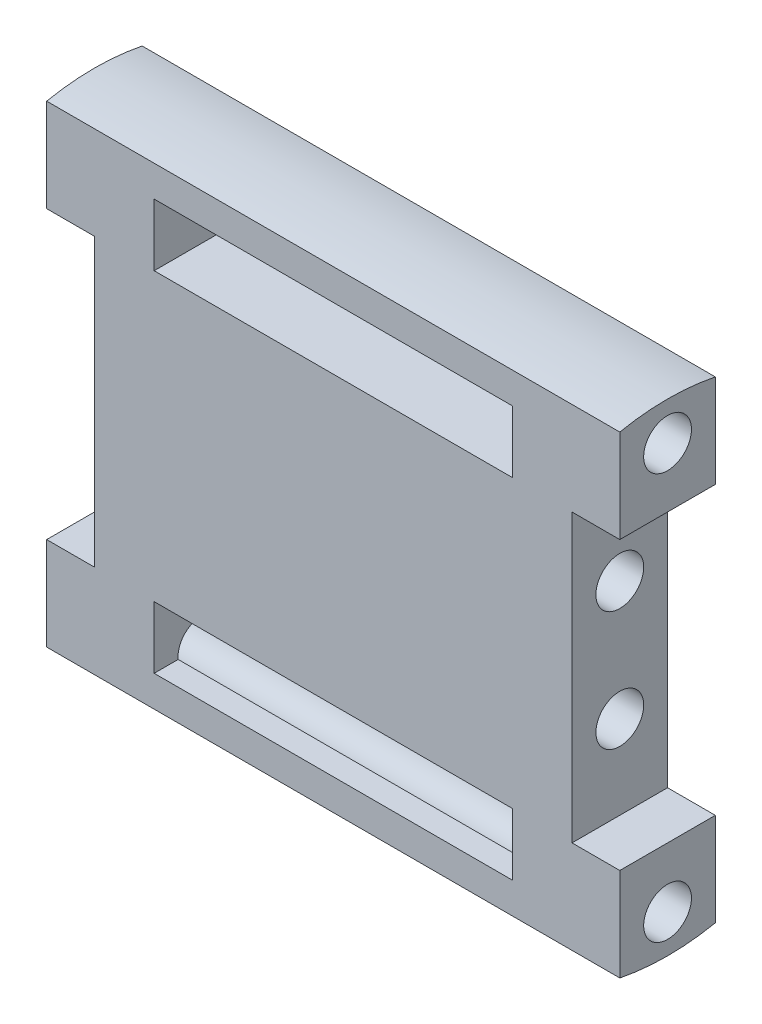
ISO-10303-21;
HEADER;
FILE_DESCRIPTION(('STEP AP214'),'2;1');
FILE_NAME('part.step','',(''),(''),'','','');
FILE_SCHEMA(('AUTOMOTIVE_DESIGN { 1 0 10303 214 1 1 1 1 }'));
ENDSEC;
DATA;
#1=APPLICATION_CONTEXT('core data for automotive mechanical design processes');
#2=APPLICATION_PROTOCOL_DEFINITION('international standard','automotive_design',2000,#1);
#3=PRODUCT_CONTEXT('',#1,'mechanical');
#4=PRODUCT('Part','Part','',(#3));
#5=PRODUCT_RELATED_PRODUCT_CATEGORY('part','',(#4));
#6=PRODUCT_DEFINITION_FORMATION('','',#4);
#7=PRODUCT_DEFINITION_CONTEXT('part definition',#1,'design');
#8=PRODUCT_DEFINITION('design','',#6,#7);
#9=PRODUCT_DEFINITION_SHAPE('','',#8);
#10=(LENGTH_UNIT() NAMED_UNIT(*) SI_UNIT(.MILLI.,.METRE.));
#11=(NAMED_UNIT(*) PLANE_ANGLE_UNIT() SI_UNIT($,.RADIAN.));
#12=(NAMED_UNIT(*) SI_UNIT($,.STERADIAN.) SOLID_ANGLE_UNIT());
#13=UNCERTAINTY_MEASURE_WITH_UNIT(LENGTH_MEASURE(1.E-05),#10,'distance_accuracy_value','');
#14=(GEOMETRIC_REPRESENTATION_CONTEXT(3) GLOBAL_UNCERTAINTY_ASSIGNED_CONTEXT((#13)) GLOBAL_UNIT_ASSIGNED_CONTEXT((#10,
#11,#12)) REPRESENTATION_CONTEXT('',''));
#15=CARTESIAN_POINT('',(0.,0.,0.));
#16=DIRECTION('',(0.,0.,1.));
#17=DIRECTION('',(1.,0.,0.));
#18=AXIS2_PLACEMENT_3D('',#15,#16,#17);
#19=CARTESIAN_POINT('',(125.,0.,0.));
#20=DIRECTION('',(-1.,0.,0.));
#21=DIRECTION('',(0.,0.,1.));
#22=AXIS2_PLACEMENT_3D('',#19,#20,#21);
#23=CYLINDRICAL_SURFACE('',#22,50.5);
#24=DIRECTION('',(-1.,0.,0.));
#25=VECTOR('',#24,1.);
#26=CARTESIAN_POINT('',(125.,49.5,-10.));
#27=LINE('',#26,#25);
#28=CARTESIAN_POINT('',(125.,49.5,-10.));
#29=VERTEX_POINT('',#28);
#30=CARTESIAN_POINT('',(5.,49.5,-10.));
#31=VERTEX_POINT('',#30);
#32=EDGE_CURVE('E362',#29,#31,#27,.T.);
#33=ORIENTED_EDGE('',*,*,#32,.T.);
#34=CARTESIAN_POINT('',(5.,0.,0.));
#35=DIRECTION('',(1.,0.,0.));
#36=DIRECTION('',(0.,0.,-1.));
#37=AXIS2_PLACEMENT_3D('',#34,#35,#36);
#38=CIRCLE('',#37,50.5);
#39=CARTESIAN_POINT('',(5.,49.5,10.));
#40=VERTEX_POINT('',#39);
#41=EDGE_CURVE('E379',#31,#40,#38,.T.);
#42=ORIENTED_EDGE('',*,*,#41,.T.);
#43=DIRECTION('',(-1.,0.,0.));
#44=VECTOR('',#43,1.);
#45=CARTESIAN_POINT('',(125.,49.5,10.));
#46=LINE('',#45,#44);
#47=CARTESIAN_POINT('',(125.,49.5,10.));
#48=VERTEX_POINT('',#47);
#49=EDGE_CURVE('E233',#48,#40,#46,.T.);
#50=ORIENTED_EDGE('',*,*,#49,.F.);
#51=CARTESIAN_POINT('',(125.,0.,0.));
#52=DIRECTION('',(1.,0.,0.));
#53=DIRECTION('',(0.,0.,-1.));
#54=AXIS2_PLACEMENT_3D('',#51,#52,#53);
#55=CIRCLE('',#54,50.5);
#56=EDGE_CURVE('E377',#29,#48,#55,.T.);
#57=ORIENTED_EDGE('',*,*,#56,.F.);
#58=EDGE_LOOP('',(#33,#42,#50,#57));
#59=FACE_BOUND('',#58,.T.);
#60=ADVANCED_FACE('F36',(#59),#23,.T.);
#61=DIRECTION('',(-1.,0.,0.));
#62=VECTOR('',#61,1.);
#63=CARTESIAN_POINT('',(125.,-49.5,10.));
#64=LINE('',#63,#62);
#65=CARTESIAN_POINT('',(125.,-49.5,9.99999999999999));
#66=VERTEX_POINT('',#65);
#67=CARTESIAN_POINT('',(5.,-49.5,10.));
#68=VERTEX_POINT('',#67);
#69=EDGE_CURVE('E365',#66,#68,#64,.T.);
#70=ORIENTED_EDGE('',*,*,#69,.T.);
#71=CARTESIAN_POINT('',(5.,-49.5,-10.));
#72=VERTEX_POINT('',#71);
#73=EDGE_CURVE('E382',#68,#72,#38,.T.);
#74=ORIENTED_EDGE('',*,*,#73,.T.);
#75=DIRECTION('',(-1.,0.,0.));
#76=VECTOR('',#75,1.);
#77=CARTESIAN_POINT('',(125.,-49.5,-10.));
#78=LINE('',#77,#76);
#79=CARTESIAN_POINT('',(125.,-49.5,-10.));
#80=VERTEX_POINT('',#79);
#81=EDGE_CURVE('E226',#80,#72,#78,.T.);
#82=ORIENTED_EDGE('',*,*,#81,.F.);
#83=EDGE_CURVE('E393',#66,#80,#55,.T.);
#84=ORIENTED_EDGE('',*,*,#83,.F.);
#85=EDGE_LOOP('',(#70,#74,#82,#84));
#86=FACE_BOUND('',#85,.T.);
#87=ADVANCED_FACE('F444',(#86),#23,.T.);
#88=CARTESIAN_POINT('',(390.,42.5,0.));
#89=DIRECTION('',(-1.,0.,0.));
#90=DIRECTION('',(0.,0.,1.));
#91=AXIS2_PLACEMENT_3D('',#88,#89,#90);
#92=CYLINDRICAL_SURFACE('',#91,5.);
#93=CARTESIAN_POINT('',(5.,42.5,0.));
#94=DIRECTION('',(1.,0.,0.));
#95=DIRECTION('',(0.,0.,-1.));
#96=AXIS2_PLACEMENT_3D('',#93,#94,#95);
#97=CIRCLE('',#96,5.);
#98=CARTESIAN_POINT('',(5.,42.5,-5.));
#99=VERTEX_POINT('',#98);
#100=EDGE_CURVE('E385',#99,#99,#97,.T.);
#101=ORIENTED_EDGE('',*,*,#100,.F.);
#102=EDGE_LOOP('',(#101));
#103=FACE_BOUND('',#102,.T.);
#104=CARTESIAN_POINT('',(27.5,42.5,0.));
#105=DIRECTION('',(-1.,0.,0.));
#106=DIRECTION('',(0.,0.,1.));
#107=AXIS2_PLACEMENT_3D('',#104,#105,#106);
#108=CIRCLE('',#107,5.);
#109=CARTESIAN_POINT('',(27.5,43.,-4.9749371855331));
#110=VERTEX_POINT('',#109);
#111=CARTESIAN_POINT('',(27.5,43.,4.9749371855331));
#112=VERTEX_POINT('',#111);
#113=EDGE_CURVE('E254',#110,#112,#108,.T.);
#114=ORIENTED_EDGE('',*,*,#113,.F.);
#115=DIRECTION('',(-1.,0.,0.));
#116=VECTOR('',#115,1.);
#117=CARTESIAN_POINT('',(390.,43.,-4.9749371855331));
#118=LINE('',#117,#116);
#119=CARTESIAN_POINT('',(102.5,43.,-4.9749371855331));
#120=VERTEX_POINT('',#119);
#121=EDGE_CURVE('E252',#120,#110,#118,.T.);
#122=ORIENTED_EDGE('',*,*,#121,.F.);
#123=CARTESIAN_POINT('',(102.5,42.5,0.));
#124=DIRECTION('',(1.,0.,0.));
#125=DIRECTION('',(0.,1.,0.));
#126=AXIS2_PLACEMENT_3D('',#123,#124,#125);
#127=CIRCLE('',#126,5.);
#128=CARTESIAN_POINT('',(102.5,43.,4.9749371855331));
#129=VERTEX_POINT('',#128);
#130=EDGE_CURVE('E247',#129,#120,#127,.T.);
#131=ORIENTED_EDGE('',*,*,#130,.F.);
#132=DIRECTION('',(-1.,0.,0.));
#133=VECTOR('',#132,1.);
#134=CARTESIAN_POINT('',(390.,43.,4.9749371855331));
#135=LINE('',#134,#133);
#136=EDGE_CURVE('E249',#112,#129,#135,.F.);
#137=ORIENTED_EDGE('',*,*,#136,.F.);
#138=EDGE_LOOP('',(#114,#122,#131,#137));
#139=FACE_BOUND('',#138,.T.);
#140=CARTESIAN_POINT('',(125.,42.5,0.));
#141=DIRECTION('',(1.,0.,0.));
#142=DIRECTION('',(0.,0.,-1.));
#143=AXIS2_PLACEMENT_3D('',#140,#141,#142);
#144=CIRCLE('',#143,5.);
#145=CARTESIAN_POINT('',(125.,42.5,-5.));
#146=VERTEX_POINT('',#145);
#147=EDGE_CURVE('E390',#146,#146,#144,.T.);
#148=ORIENTED_EDGE('',*,*,#147,.T.);
#149=EDGE_LOOP('',(#148));
#150=FACE_BOUND('',#149,.T.);
#151=ADVANCED_FACE('F448',(#103,#139,#150),#92,.F.);
#152=CARTESIAN_POINT('',(390.,-42.5,0.));
#153=DIRECTION('',(-1.,0.,0.));
#154=DIRECTION('',(0.,0.,1.));
#155=AXIS2_PLACEMENT_3D('',#152,#153,#154);
#156=CYLINDRICAL_SURFACE('',#155,5.);
#157=CARTESIAN_POINT('',(5.,-42.5,0.));
#158=DIRECTION('',(1.,0.,0.));
#159=DIRECTION('',(0.,0.,-1.));
#160=AXIS2_PLACEMENT_3D('',#157,#158,#159);
#161=CIRCLE('',#160,5.);
#162=CARTESIAN_POINT('',(5.,-42.5,-5.));
#163=VERTEX_POINT('',#162);
#164=EDGE_CURVE('E381',#163,#163,#161,.T.);
#165=ORIENTED_EDGE('',*,*,#164,.F.);
#166=EDGE_LOOP('',(#165));
#167=FACE_BOUND('',#166,.T.);
#168=DIRECTION('',(-1.,0.,0.));
#169=VECTOR('',#168,1.);
#170=CARTESIAN_POINT('',(390.,-43.,4.9749371855331));
#171=LINE('',#170,#169);
#172=CARTESIAN_POINT('',(102.5,-43.,4.9749371855331));
#173=VERTEX_POINT('',#172);
#174=CARTESIAN_POINT('',(27.5,-43.,4.9749371855331));
#175=VERTEX_POINT('',#174);
#176=EDGE_CURVE('E245',#173,#175,#171,.T.);
#177=ORIENTED_EDGE('',*,*,#176,.F.);
#178=CARTESIAN_POINT('',(102.5,-42.5,0.));
#179=DIRECTION('',(1.,0.,0.));
#180=DIRECTION('',(0.,1.,0.));
#181=AXIS2_PLACEMENT_3D('',#178,#179,#180);
#182=CIRCLE('',#181,5.);
#183=CARTESIAN_POINT('',(102.5,-43.,-4.9749371855331));
#184=VERTEX_POINT('',#183);
#185=EDGE_CURVE('E240',#184,#173,#182,.T.);
#186=ORIENTED_EDGE('',*,*,#185,.F.);
#187=DIRECTION('',(-1.,0.,0.));
#188=VECTOR('',#187,1.);
#189=CARTESIAN_POINT('',(390.,-43.,-4.9749371855331));
#190=LINE('',#189,#188);
#191=CARTESIAN_POINT('',(27.5,-43.,-4.9749371855331));
#192=VERTEX_POINT('',#191);
#193=EDGE_CURVE('E238',#192,#184,#190,.F.);
#194=ORIENTED_EDGE('',*,*,#193,.F.);
#195=CARTESIAN_POINT('',(27.5,-42.5,0.));
#196=DIRECTION('',(-1.,0.,0.));
#197=DIRECTION('',(0.,-1.,0.));
#198=AXIS2_PLACEMENT_3D('',#195,#196,#197);
#199=CIRCLE('',#198,5.);
#200=EDGE_CURVE('E242',#175,#192,#199,.T.);
#201=ORIENTED_EDGE('',*,*,#200,.F.);
#202=EDGE_LOOP('',(#177,#186,#194,#201));
#203=FACE_BOUND('',#202,.T.);
#204=CARTESIAN_POINT('',(125.,-42.5,0.));
#205=DIRECTION('',(1.,0.,0.));
#206=DIRECTION('',(0.,0.,-1.));
#207=AXIS2_PLACEMENT_3D('',#204,#205,#206);
#208=CIRCLE('',#207,5.);
#209=CARTESIAN_POINT('',(125.,-42.5,-5.));
#210=VERTEX_POINT('',#209);
#211=EDGE_CURVE('E40',#210,#210,#208,.T.);
#212=ORIENTED_EDGE('',*,*,#211,.T.);
#213=EDGE_LOOP('',(#212));
#214=FACE_BOUND('',#213,.T.);
#215=ADVANCED_FACE('F429',(#167,#203,#214),#156,.F.);
#216=CARTESIAN_POINT('',(125.,0.,0.));
#217=DIRECTION('',(-1.,0.,0.));
#218=DIRECTION('',(0.,0.,1.));
#219=AXIS2_PLACEMENT_3D('',#216,#217,#218);
#220=PLANE('',#219);
#221=DIRECTION('',(0.,1.,0.));
#222=VECTOR('',#221,1.);
#223=CARTESIAN_POINT('',(125.,49.5,-10.));
#224=LINE('',#223,#222);
#225=CARTESIAN_POINT('',(125.,30.,-10.));
#226=VERTEX_POINT('',#225);
#227=EDGE_CURVE('E359',#226,#29,#224,.T.);
#228=ORIENTED_EDGE('',*,*,#227,.T.);
#229=ORIENTED_EDGE('',*,*,#56,.T.);
#230=DIRECTION('',(0.,-1.,0.));
#231=VECTOR('',#230,1.);
#232=CARTESIAN_POINT('',(125.,49.5,10.));
#233=LINE('',#232,#231);
#234=CARTESIAN_POINT('',(125.,30.,10.));
#235=VERTEX_POINT('',#234);
#236=EDGE_CURVE('E357',#48,#235,#233,.T.);
#237=ORIENTED_EDGE('',*,*,#236,.T.);
#238=DIRECTION('',(0.,0.,-1.));
#239=VECTOR('',#238,1.);
#240=CARTESIAN_POINT('',(125.,30.,0.));
#241=LINE('',#240,#239);
#242=EDGE_CURVE('E230',#235,#226,#241,.T.);
#243=ORIENTED_EDGE('',*,*,#242,.T.);
#244=EDGE_LOOP('',(#228,#229,#237,#243));
#245=FACE_BOUND('',#244,.T.);
#246=ORIENTED_EDGE('',*,*,#147,.F.);
#247=EDGE_LOOP('',(#246));
#248=FACE_BOUND('',#247,.T.);
#249=ADVANCED_FACE('F458',(#245,#248),#220,.F.);
#250=CARTESIAN_POINT('',(125.,49.5,10.));
#251=DIRECTION('',(0.,0.,-1.));
#252=DIRECTION('',(0.,1.,0.));
#253=AXIS2_PLACEMENT_3D('',#250,#251,#252);
#254=PLANE('',#253);
#255=DIRECTION('',(1.,0.,0.));
#256=VECTOR('',#255,1.);
#257=CARTESIAN_POINT('',(27.5,30.,10.));
#258=LINE('',#257,#256);
#259=CARTESIAN_POINT('',(27.5,30.,10.));
#260=VERTEX_POINT('',#259);
#261=CARTESIAN_POINT('',(102.5,30.,10.));
#262=VERTEX_POINT('',#261);
#263=EDGE_CURVE('E396',#260,#262,#258,.T.);
#264=ORIENTED_EDGE('',*,*,#263,.F.);
#265=DIRECTION('',(0.,-1.,0.));
#266=VECTOR('',#265,1.);
#267=CARTESIAN_POINT('',(27.5,43.,10.));
#268=LINE('',#267,#266);
#269=CARTESIAN_POINT('',(27.5,43.,10.));
#270=VERTEX_POINT('',#269);
#271=EDGE_CURVE('E52',#270,#260,#268,.T.);
#272=ORIENTED_EDGE('',*,*,#271,.F.);
#273=DIRECTION('',(-1.,0.,0.));
#274=VECTOR('',#273,1.);
#275=CARTESIAN_POINT('',(27.5,43.,10.));
#276=LINE('',#275,#274);
#277=CARTESIAN_POINT('',(102.5,43.,10.));
#278=VERTEX_POINT('',#277);
#279=EDGE_CURVE('E402',#278,#270,#276,.T.);
#280=ORIENTED_EDGE('',*,*,#279,.F.);
#281=DIRECTION('',(0.,1.,0.));
#282=VECTOR('',#281,1.);
#283=CARTESIAN_POINT('',(102.5,43.,10.));
#284=LINE('',#283,#282);
#285=EDGE_CURVE('E399',#262,#278,#284,.T.);
#286=ORIENTED_EDGE('',*,*,#285,.F.);
#287=EDGE_LOOP('',(#264,#272,#280,#286));
#288=FACE_BOUND('',#287,.T.);
#289=DIRECTION('',(1.,0.,0.));
#290=VECTOR('',#289,1.);
#291=CARTESIAN_POINT('',(27.5,-43.,10.));
#292=LINE('',#291,#290);
#293=CARTESIAN_POINT('',(27.5,-43.,10.));
#294=VERTEX_POINT('',#293);
#295=CARTESIAN_POINT('',(102.5,-43.,10.));
#296=VERTEX_POINT('',#295);
#297=EDGE_CURVE('E415',#294,#296,#292,.T.);
#298=ORIENTED_EDGE('',*,*,#297,.F.);
#299=DIRECTION('',(0.,-1.,0.));
#300=VECTOR('',#299,1.);
#301=CARTESIAN_POINT('',(27.5,-43.,10.));
#302=LINE('',#301,#300);
#303=CARTESIAN_POINT('',(27.5,-30.,10.));
#304=VERTEX_POINT('',#303);
#305=EDGE_CURVE('E60',#304,#294,#302,.T.);
#306=ORIENTED_EDGE('',*,*,#305,.F.);
#307=DIRECTION('',(-1.,0.,0.));
#308=VECTOR('',#307,1.);
#309=CARTESIAN_POINT('',(27.5,-30.,10.));
#310=LINE('',#309,#308);
#311=CARTESIAN_POINT('',(102.5,-30.,10.));
#312=VERTEX_POINT('',#311);
#313=EDGE_CURVE('E288',#312,#304,#310,.T.);
#314=ORIENTED_EDGE('',*,*,#313,.F.);
#315=DIRECTION('',(0.,1.,0.));
#316=VECTOR('',#315,1.);
#317=CARTESIAN_POINT('',(102.5,-43.,10.));
#318=LINE('',#317,#316);
#319=EDGE_CURVE('E276',#296,#312,#318,.T.);
#320=ORIENTED_EDGE('',*,*,#319,.F.);
#321=EDGE_LOOP('',(#298,#306,#314,#320));
#322=FACE_BOUND('',#321,.T.);
#323=DIRECTION('',(0.,-1.,0.));
#324=VECTOR('',#323,1.);
#325=CARTESIAN_POINT('',(5.,49.5,10.));
#326=LINE('',#325,#324);
#327=CARTESIAN_POINT('',(5.,30.,10.));
#328=VERTEX_POINT('',#327);
#329=EDGE_CURVE('E353',#40,#328,#326,.T.);
#330=ORIENTED_EDGE('',*,*,#329,.T.);
#331=DIRECTION('',(1.,0.,0.));
#332=VECTOR('',#331,1.);
#333=CARTESIAN_POINT('',(125.,30.,10.));
#334=LINE('',#333,#332);
#335=CARTESIAN_POINT('',(15.,30.,10.));
#336=VERTEX_POINT('',#335);
#337=EDGE_CURVE('E338',#328,#336,#334,.T.);
#338=ORIENTED_EDGE('',*,*,#337,.T.);
#339=DIRECTION('',(0.,-1.,0.));
#340=VECTOR('',#339,1.);
#341=CARTESIAN_POINT('',(15.,49.5,10.));
#342=LINE('',#341,#340);
#343=CARTESIAN_POINT('',(15.,-30.,10.));
#344=VERTEX_POINT('',#343);
#345=EDGE_CURVE('E350',#336,#344,#342,.T.);
#346=ORIENTED_EDGE('',*,*,#345,.T.);
#347=DIRECTION('',(-1.,0.,0.));
#348=VECTOR('',#347,1.);
#349=CARTESIAN_POINT('',(125.,-30.,10.));
#350=LINE('',#349,#348);
#351=CARTESIAN_POINT('',(5.,-30.,10.));
#352=VERTEX_POINT('',#351);
#353=EDGE_CURVE('E322',#344,#352,#350,.T.);
#354=ORIENTED_EDGE('',*,*,#353,.T.);
#355=EDGE_CURVE('E206',#352,#68,#326,.T.);
#356=ORIENTED_EDGE('',*,*,#355,.T.);
#357=ORIENTED_EDGE('',*,*,#69,.F.);
#358=CARTESIAN_POINT('',(125.,-30.,10.));
#359=VERTEX_POINT('',#358);
#360=EDGE_CURVE('E356',#359,#66,#233,.T.);
#361=ORIENTED_EDGE('',*,*,#360,.F.);
#362=DIRECTION('',(-1.,0.,0.));
#363=VECTOR('',#362,1.);
#364=CARTESIAN_POINT('',(125.,-30.,10.));
#365=LINE('',#364,#363);
#366=CARTESIAN_POINT('',(115.,-30.,10.));
#367=VERTEX_POINT('',#366);
#368=EDGE_CURVE('E341',#359,#367,#365,.T.);
#369=ORIENTED_EDGE('',*,*,#368,.T.);
#370=DIRECTION('',(0.,1.,0.));
#371=VECTOR('',#370,1.);
#372=CARTESIAN_POINT('',(115.,49.5,10.));
#373=LINE('',#372,#371);
#374=CARTESIAN_POINT('',(115.,30.,10.));
#375=VERTEX_POINT('',#374);
#376=EDGE_CURVE('E347',#367,#375,#373,.T.);
#377=ORIENTED_EDGE('',*,*,#376,.T.);
#378=DIRECTION('',(1.,0.,0.));
#379=VECTOR('',#378,1.);
#380=CARTESIAN_POINT('',(125.,30.,10.));
#381=LINE('',#380,#379);
#382=EDGE_CURVE('E344',#375,#235,#381,.T.);
#383=ORIENTED_EDGE('',*,*,#382,.T.);
#384=ORIENTED_EDGE('',*,*,#236,.F.);
#385=ORIENTED_EDGE('',*,*,#49,.T.);
#386=EDGE_LOOP('',(#330,#338,#346,#354,#356,#357,#361,#369,#377,#383,#384,#385));
#387=FACE_BOUND('',#386,.T.);
#388=ADVANCED_FACE('F38',(#288,#322,#387),#254,.F.);
#389=CARTESIAN_POINT('',(125.,49.5,-10.));
#390=DIRECTION('',(0.,0.,1.));
#391=DIRECTION('',(1.,0.,0.));
#392=AXIS2_PLACEMENT_3D('',#389,#390,#391);
#393=PLANE('',#392);
#394=DIRECTION('',(-1.,0.,0.));
#395=VECTOR('',#394,1.);
#396=CARTESIAN_POINT('',(125.,43.,-10.));
#397=LINE('',#396,#395);
#398=CARTESIAN_POINT('',(102.5,43.,-10.));
#399=VERTEX_POINT('',#398);
#400=CARTESIAN_POINT('',(27.5,43.,-10.));
#401=VERTEX_POINT('',#400);
#402=EDGE_CURVE('E297',#399,#401,#397,.T.);
#403=ORIENTED_EDGE('',*,*,#402,.T.);
#404=DIRECTION('',(0.,-1.,0.));
#405=VECTOR('',#404,1.);
#406=CARTESIAN_POINT('',(27.5,49.5,-10.));
#407=LINE('',#406,#405);
#408=CARTESIAN_POINT('',(27.5,30.,-10.));
#409=VERTEX_POINT('',#408);
#410=EDGE_CURVE('E300',#401,#409,#407,.T.);
#411=ORIENTED_EDGE('',*,*,#410,.T.);
#412=DIRECTION('',(1.,0.,0.));
#413=VECTOR('',#412,1.);
#414=CARTESIAN_POINT('',(125.,30.,-10.));
#415=LINE('',#414,#413);
#416=CARTESIAN_POINT('',(102.5,30.,-10.));
#417=VERTEX_POINT('',#416);
#418=EDGE_CURVE('E12',#409,#417,#415,.T.);
#419=ORIENTED_EDGE('',*,*,#418,.T.);
#420=DIRECTION('',(0.,1.,0.));
#421=VECTOR('',#420,1.);
#422=CARTESIAN_POINT('',(102.5,49.5,-10.));
#423=LINE('',#422,#421);
#424=EDGE_CURVE('E294',#417,#399,#423,.T.);
#425=ORIENTED_EDGE('',*,*,#424,.T.);
#426=EDGE_LOOP('',(#403,#411,#419,#425));
#427=FACE_BOUND('',#426,.T.);
#428=DIRECTION('',(-1.,0.,0.));
#429=VECTOR('',#428,1.);
#430=CARTESIAN_POINT('',(125.,-30.,-10.));
#431=LINE('',#430,#429);
#432=CARTESIAN_POINT('',(102.5,-30.,-10.));
#433=VERTEX_POINT('',#432);
#434=CARTESIAN_POINT('',(27.5,-30.,-10.));
#435=VERTEX_POINT('',#434);
#436=EDGE_CURVE('E45',#433,#435,#431,.T.);
#437=ORIENTED_EDGE('',*,*,#436,.T.);
#438=DIRECTION('',(0.,-1.,0.));
#439=VECTOR('',#438,1.);
#440=CARTESIAN_POINT('',(27.4999999999998,49.4999999999998,-10.));
#441=LINE('',#440,#439);
#442=CARTESIAN_POINT('',(27.5,-43.,-10.));
#443=VERTEX_POINT('',#442);
#444=EDGE_CURVE('E261',#435,#443,#441,.T.);
#445=ORIENTED_EDGE('',*,*,#444,.T.);
#446=DIRECTION('',(1.,0.,0.));
#447=VECTOR('',#446,1.);
#448=CARTESIAN_POINT('',(125.,-43.,-10.));
#449=LINE('',#448,#447);
#450=CARTESIAN_POINT('',(102.5,-43.,-10.));
#451=VERTEX_POINT('',#450);
#452=EDGE_CURVE('E289',#443,#451,#449,.T.);
#453=ORIENTED_EDGE('',*,*,#452,.T.);
#454=DIRECTION('',(0.,1.,0.));
#455=VECTOR('',#454,1.);
#456=CARTESIAN_POINT('',(102.5,49.5,-10.));
#457=LINE('',#456,#455);
#458=EDGE_CURVE('E263',#451,#433,#457,.T.);
#459=ORIENTED_EDGE('',*,*,#458,.T.);
#460=EDGE_LOOP('',(#437,#445,#453,#459));
#461=FACE_BOUND('',#460,.T.);
#462=DIRECTION('',(0.,-1.,0.));
#463=VECTOR('',#462,1.);
#464=CARTESIAN_POINT('',(15.,30.,-10.));
#465=LINE('',#464,#463);
#466=CARTESIAN_POINT('',(15.,30.,-10.));
#467=VERTEX_POINT('',#466);
#468=CARTESIAN_POINT('',(15.,-30.,-10.));
#469=VERTEX_POINT('',#468);
#470=EDGE_CURVE('E220',#467,#469,#465,.T.);
#471=ORIENTED_EDGE('',*,*,#470,.F.);
#472=DIRECTION('',(1.,0.,0.));
#473=VECTOR('',#472,1.);
#474=CARTESIAN_POINT('',(15.,30.,-10.));
#475=LINE('',#474,#473);
#476=CARTESIAN_POINT('',(5.00000000000001,30.,-10.));
#477=VERTEX_POINT('',#476);
#478=EDGE_CURVE('E219',#477,#467,#475,.T.);
#479=ORIENTED_EDGE('',*,*,#478,.F.);
#480=DIRECTION('',(0.,1.,0.));
#481=VECTOR('',#480,1.);
#482=CARTESIAN_POINT('',(5.,49.5,-10.));
#483=LINE('',#482,#481);
#484=EDGE_CURVE('E228',#477,#31,#483,.T.);
#485=ORIENTED_EDGE('',*,*,#484,.T.);
#486=ORIENTED_EDGE('',*,*,#32,.F.);
#487=ORIENTED_EDGE('',*,*,#227,.F.);
#488=DIRECTION('',(1.,0.,0.));
#489=VECTOR('',#488,1.);
#490=CARTESIAN_POINT('',(115.,30.,-10.));
#491=LINE('',#490,#489);
#492=CARTESIAN_POINT('',(115.,30.,-10.));
#493=VERTEX_POINT('',#492);
#494=EDGE_CURVE('E315',#493,#226,#491,.T.);
#495=ORIENTED_EDGE('',*,*,#494,.F.);
#496=DIRECTION('',(0.,1.,0.));
#497=VECTOR('',#496,1.);
#498=CARTESIAN_POINT('',(115.,30.,-10.));
#499=LINE('',#498,#497);
#500=CARTESIAN_POINT('',(115.,-30.,-10.));
#501=VERTEX_POINT('',#500);
#502=EDGE_CURVE('E331',#501,#493,#499,.T.);
#503=ORIENTED_EDGE('',*,*,#502,.F.);
#504=DIRECTION('',(-1.,0.,0.));
#505=VECTOR('',#504,1.);
#506=CARTESIAN_POINT('',(115.,-30.,-10.));
#507=LINE('',#506,#505);
#508=CARTESIAN_POINT('',(125.,-30.,-10.));
#509=VERTEX_POINT('',#508);
#510=EDGE_CURVE('E328',#509,#501,#507,.T.);
#511=ORIENTED_EDGE('',*,*,#510,.F.);
#512=EDGE_CURVE('E360',#80,#509,#224,.T.);
#513=ORIENTED_EDGE('',*,*,#512,.F.);
#514=ORIENTED_EDGE('',*,*,#81,.T.);
#515=CARTESIAN_POINT('',(5.,-30.,-10.));
#516=VERTEX_POINT('',#515);
#517=EDGE_CURVE('E203',#72,#516,#483,.T.);
#518=ORIENTED_EDGE('',*,*,#517,.T.);
#519=DIRECTION('',(-1.,0.,0.));
#520=VECTOR('',#519,1.);
#521=CARTESIAN_POINT('',(15.,-30.,-10.));
#522=LINE('',#521,#520);
#523=EDGE_CURVE('E213',#469,#516,#522,.T.);
#524=ORIENTED_EDGE('',*,*,#523,.F.);
#525=EDGE_LOOP('',(#471,#479,#485,#486,#487,#495,#503,#511,#513,#514,#518,#524));
#526=FACE_BOUND('',#525,.T.);
#527=ADVANCED_FACE('F223',(#427,#461,#526),#393,.F.);
#528=ORIENTED_EDGE('',*,*,#360,.T.);
#529=ORIENTED_EDGE('',*,*,#83,.T.);
#530=ORIENTED_EDGE('',*,*,#512,.T.);
#531=DIRECTION('',(0.,0.,1.));
#532=VECTOR('',#531,1.);
#533=CARTESIAN_POINT('',(125.,-30.,0.));
#534=LINE('',#533,#532);
#535=EDGE_CURVE('E227',#509,#359,#534,.T.);
#536=ORIENTED_EDGE('',*,*,#535,.T.);
#537=EDGE_LOOP('',(#528,#529,#530,#536));
#538=FACE_BOUND('',#537,.T.);
#539=ORIENTED_EDGE('',*,*,#211,.F.);
#540=EDGE_LOOP('',(#539));
#541=FACE_BOUND('',#540,.T.);
#542=ADVANCED_FACE('F452',(#538,#541),#220,.F.);
#543=CARTESIAN_POINT('',(15.,30.,50.5));
#544=DIRECTION('',(1.,0.,0.));
#545=DIRECTION('',(0.,0.,-1.));
#546=AXIS2_PLACEMENT_3D('',#543,#544,#545);
#547=PLANE('',#546);
#548=CARTESIAN_POINT('',(15.,12.5,0.));
#549=DIRECTION('',(1.,0.,0.));
#550=DIRECTION('',(0.,0.,-1.));
#551=AXIS2_PLACEMENT_3D('',#548,#549,#550);
#552=CIRCLE('',#551,5.);
#553=CARTESIAN_POINT('',(15.,12.5,-5.));
#554=VERTEX_POINT('',#553);
#555=EDGE_CURVE('E312',#554,#554,#552,.F.);
#556=ORIENTED_EDGE('',*,*,#555,.F.);
#557=EDGE_LOOP('',(#556));
#558=FACE_BOUND('',#557,.T.);
#559=CARTESIAN_POINT('',(15.,-12.5,0.));
#560=DIRECTION('',(1.,0.,0.));
#561=DIRECTION('',(0.,0.,-1.));
#562=AXIS2_PLACEMENT_3D('',#559,#560,#561);
#563=CIRCLE('',#562,5.);
#564=CARTESIAN_POINT('',(15.,-12.5,-5.00000000000001));
#565=VERTEX_POINT('',#564);
#566=EDGE_CURVE('E306',#565,#565,#563,.F.);
#567=ORIENTED_EDGE('',*,*,#566,.F.);
#568=EDGE_LOOP('',(#567));
#569=FACE_BOUND('',#568,.T.);
#570=DIRECTION('',(0.,0.,-1.));
#571=VECTOR('',#570,1.);
#572=CARTESIAN_POINT('',(15.,30.,50.5));
#573=LINE('',#572,#571);
#574=EDGE_CURVE('E320',#336,#467,#573,.T.);
#575=ORIENTED_EDGE('',*,*,#574,.T.);
#576=ORIENTED_EDGE('',*,*,#470,.T.);
#577=DIRECTION('',(0.,0.,-1.));
#578=VECTOR('',#577,1.);
#579=CARTESIAN_POINT('',(15.,-30.,50.5));
#580=LINE('',#579,#578);
#581=EDGE_CURVE('E210',#344,#469,#580,.T.);
#582=ORIENTED_EDGE('',*,*,#581,.F.);
#583=ORIENTED_EDGE('',*,*,#345,.F.);
#584=EDGE_LOOP('',(#575,#576,#582,#583));
#585=FACE_BOUND('',#584,.T.);
#586=ADVANCED_FACE('F456',(#558,#569,#585),#547,.F.);
#587=CARTESIAN_POINT('',(15.,30.,50.5));
#588=DIRECTION('',(0.,1.,0.));
#589=DIRECTION('',(-1.,0.,0.));
#590=AXIS2_PLACEMENT_3D('',#587,#588,#589);
#591=PLANE('',#590);
#592=DIRECTION('',(0.,0.,-1.));
#593=VECTOR('',#592,1.);
#594=CARTESIAN_POINT('',(5.00000000000001,30.,50.5));
#595=LINE('',#594,#593);
#596=EDGE_CURVE('E209',#328,#477,#595,.T.);
#597=ORIENTED_EDGE('',*,*,#596,.T.);
#598=ORIENTED_EDGE('',*,*,#478,.T.);
#599=ORIENTED_EDGE('',*,*,#574,.F.);
#600=ORIENTED_EDGE('',*,*,#337,.F.);
#601=EDGE_LOOP('',(#597,#598,#599,#600));
#602=FACE_BOUND('',#601,.T.);
#603=ADVANCED_FACE('F474',(#602),#591,.F.);
#604=CARTESIAN_POINT('',(15.,-30.,50.5));
#605=DIRECTION('',(0.,-1.,0.));
#606=DIRECTION('',(0.,0.,-1.));
#607=AXIS2_PLACEMENT_3D('',#604,#605,#606);
#608=PLANE('',#607);
#609=ORIENTED_EDGE('',*,*,#581,.T.);
#610=ORIENTED_EDGE('',*,*,#523,.T.);
#611=DIRECTION('',(0.,0.,-1.));
#612=VECTOR('',#611,1.);
#613=CARTESIAN_POINT('',(5.00000000000001,-30.,50.5));
#614=LINE('',#613,#612);
#615=EDGE_CURVE('E199',#352,#516,#614,.T.);
#616=ORIENTED_EDGE('',*,*,#615,.F.);
#617=ORIENTED_EDGE('',*,*,#353,.F.);
#618=EDGE_LOOP('',(#609,#610,#616,#617));
#619=FACE_BOUND('',#618,.T.);
#620=ADVANCED_FACE('F214',(#619),#608,.F.);
#621=CARTESIAN_POINT('',(115.,30.,50.5));
#622=DIRECTION('',(-1.,0.,0.));
#623=DIRECTION('',(0.,0.,1.));
#624=AXIS2_PLACEMENT_3D('',#621,#622,#623);
#625=PLANE('',#624);
#626=CARTESIAN_POINT('',(115.,12.5,0.));
#627=DIRECTION('',(-1.,0.,0.));
#628=DIRECTION('',(0.,0.,1.));
#629=AXIS2_PLACEMENT_3D('',#626,#627,#628);
#630=CIRCLE('',#629,5.);
#631=CARTESIAN_POINT('',(115.,12.5,5.00000000000001));
#632=VERTEX_POINT('',#631);
#633=EDGE_CURVE('E309',#632,#632,#630,.F.);
#634=ORIENTED_EDGE('',*,*,#633,.F.);
#635=EDGE_LOOP('',(#634));
#636=FACE_BOUND('',#635,.T.);
#637=CARTESIAN_POINT('',(115.,-12.5,0.));
#638=DIRECTION('',(-1.,0.,0.));
#639=DIRECTION('',(0.,0.,1.));
#640=AXIS2_PLACEMENT_3D('',#637,#638,#639);
#641=CIRCLE('',#640,5.);
#642=CARTESIAN_POINT('',(115.,-12.5,5.));
#643=VERTEX_POINT('',#642);
#644=EDGE_CURVE('E303',#643,#643,#641,.F.);
#645=ORIENTED_EDGE('',*,*,#644,.F.);
#646=EDGE_LOOP('',(#645));
#647=FACE_BOUND('',#646,.T.);
#648=DIRECTION('',(0.,0.,-1.));
#649=VECTOR('',#648,1.);
#650=CARTESIAN_POINT('',(115.,-30.,50.5));
#651=LINE('',#650,#649);
#652=EDGE_CURVE('E334',#367,#501,#651,.T.);
#653=ORIENTED_EDGE('',*,*,#652,.T.);
#654=ORIENTED_EDGE('',*,*,#502,.T.);
#655=DIRECTION('',(0.,0.,-1.));
#656=VECTOR('',#655,1.);
#657=CARTESIAN_POINT('',(115.,30.,50.5));
#658=LINE('',#657,#656);
#659=EDGE_CURVE('E316',#375,#493,#658,.T.);
#660=ORIENTED_EDGE('',*,*,#659,.F.);
#661=ORIENTED_EDGE('',*,*,#376,.F.);
#662=EDGE_LOOP('',(#653,#654,#660,#661));
#663=FACE_BOUND('',#662,.T.);
#664=ADVANCED_FACE('F463',(#636,#647,#663),#625,.F.);
#665=CARTESIAN_POINT('',(115.,30.,50.5));
#666=DIRECTION('',(0.,1.,0.));
#667=DIRECTION('',(-1.,0.,0.));
#668=AXIS2_PLACEMENT_3D('',#665,#666,#667);
#669=PLANE('',#668);
#670=ORIENTED_EDGE('',*,*,#659,.T.);
#671=ORIENTED_EDGE('',*,*,#494,.T.);
#672=ORIENTED_EDGE('',*,*,#242,.F.);
#673=ORIENTED_EDGE('',*,*,#382,.F.);
#674=EDGE_LOOP('',(#670,#671,#672,#673));
#675=FACE_BOUND('',#674,.T.);
#676=ADVANCED_FACE('F459',(#675),#669,.F.);
#677=CARTESIAN_POINT('',(115.,-30.,50.5));
#678=DIRECTION('',(0.,-1.,0.));
#679=DIRECTION('',(1.,0.,0.));
#680=AXIS2_PLACEMENT_3D('',#677,#678,#679);
#681=PLANE('',#680);
#682=ORIENTED_EDGE('',*,*,#535,.F.);
#683=ORIENTED_EDGE('',*,*,#510,.T.);
#684=ORIENTED_EDGE('',*,*,#652,.F.);
#685=ORIENTED_EDGE('',*,*,#368,.F.);
#686=EDGE_LOOP('',(#682,#683,#684,#685));
#687=FACE_BOUND('',#686,.T.);
#688=ADVANCED_FACE('F462',(#687),#681,.F.);
#689=CARTESIAN_POINT('',(390.,-12.5,0.));
#690=DIRECTION('',(-1.,0.,0.));
#691=DIRECTION('',(0.,0.,1.));
#692=AXIS2_PLACEMENT_3D('',#689,#690,#691);
#693=CYLINDRICAL_SURFACE('',#692,5.);
#694=ORIENTED_EDGE('',*,*,#644,.T.);
#695=EDGE_LOOP('',(#694));
#696=FACE_BOUND('',#695,.T.);
#697=ORIENTED_EDGE('',*,*,#566,.T.);
#698=EDGE_LOOP('',(#697));
#699=FACE_BOUND('',#698,.T.);
#700=ADVANCED_FACE('F467',(#696,#699),#693,.F.);
#701=CARTESIAN_POINT('',(390.,12.5,0.));
#702=DIRECTION('',(-1.,0.,0.));
#703=DIRECTION('',(0.,0.,1.));
#704=AXIS2_PLACEMENT_3D('',#701,#702,#703);
#705=CYLINDRICAL_SURFACE('',#704,5.);
#706=ORIENTED_EDGE('',*,*,#633,.T.);
#707=EDGE_LOOP('',(#706));
#708=FACE_BOUND('',#707,.T.);
#709=ORIENTED_EDGE('',*,*,#555,.T.);
#710=EDGE_LOOP('',(#709));
#711=FACE_BOUND('',#710,.T.);
#712=ADVANCED_FACE('F489',(#708,#711),#705,.F.);
#713=CARTESIAN_POINT('',(27.5,-30.,-50.5));
#714=DIRECTION('',(0.,1.,0.));
#715=DIRECTION('',(-1.,0.,0.));
#716=AXIS2_PLACEMENT_3D('',#713,#714,#715);
#717=PLANE('',#716);
#718=DIRECTION('',(0.,0.,1.));
#719=VECTOR('',#718,1.);
#720=CARTESIAN_POINT('',(102.5,-30.,-50.5));
#721=LINE('',#720,#719);
#722=EDGE_CURVE('E269',#433,#312,#721,.T.);
#723=ORIENTED_EDGE('',*,*,#722,.T.);
#724=ORIENTED_EDGE('',*,*,#313,.T.);
#725=DIRECTION('',(0.,0.,1.));
#726=VECTOR('',#725,1.);
#727=CARTESIAN_POINT('',(27.5,-30.,-50.5));
#728=LINE('',#727,#726);
#729=EDGE_CURVE('E271',#435,#304,#728,.T.);
#730=ORIENTED_EDGE('',*,*,#729,.F.);
#731=ORIENTED_EDGE('',*,*,#436,.F.);
#732=EDGE_LOOP('',(#723,#724,#730,#731));
#733=FACE_BOUND('',#732,.T.);
#734=ADVANCED_FACE('F267',(#733),#717,.F.);
#735=CARTESIAN_POINT('',(27.5,-43.,-50.5));
#736=DIRECTION('',(-1.,0.,0.));
#737=DIRECTION('',(0.,-1.,0.));
#738=AXIS2_PLACEMENT_3D('',#735,#736,#737);
#739=PLANE('',#738);
#740=ORIENTED_EDGE('',*,*,#729,.T.);
#741=ORIENTED_EDGE('',*,*,#305,.T.);
#742=DIRECTION('',(0.,0.,1.));
#743=VECTOR('',#742,1.);
#744=CARTESIAN_POINT('',(27.5,-43.,-50.5));
#745=LINE('',#744,#743);
#746=EDGE_CURVE('E286',#175,#294,#745,.T.);
#747=ORIENTED_EDGE('',*,*,#746,.F.);
#748=ORIENTED_EDGE('',*,*,#200,.T.);
#749=EDGE_CURVE('E285',#443,#192,#745,.T.);
#750=ORIENTED_EDGE('',*,*,#749,.F.);
#751=ORIENTED_EDGE('',*,*,#444,.F.);
#752=EDGE_LOOP('',(#740,#741,#747,#748,#750,#751));
#753=FACE_BOUND('',#752,.T.);
#754=ADVANCED_FACE('F425',(#753),#739,.F.);
#755=CARTESIAN_POINT('',(102.5,-43.,-50.5));
#756=DIRECTION('',(1.,0.,0.));
#757=DIRECTION('',(0.,1.,0.));
#758=AXIS2_PLACEMENT_3D('',#755,#756,#757);
#759=PLANE('',#758);
#760=DIRECTION('',(0.,0.,1.));
#761=VECTOR('',#760,1.);
#762=CARTESIAN_POINT('',(102.5,-43.,-50.5));
#763=LINE('',#762,#761);
#764=EDGE_CURVE('E278',#451,#184,#763,.T.);
#765=ORIENTED_EDGE('',*,*,#764,.T.);
#766=ORIENTED_EDGE('',*,*,#185,.T.);
#767=EDGE_CURVE('E281',#173,#296,#763,.T.);
#768=ORIENTED_EDGE('',*,*,#767,.T.);
#769=ORIENTED_EDGE('',*,*,#319,.T.);
#770=ORIENTED_EDGE('',*,*,#722,.F.);
#771=ORIENTED_EDGE('',*,*,#458,.F.);
#772=EDGE_LOOP('',(#765,#766,#768,#769,#770,#771));
#773=FACE_BOUND('',#772,.T.);
#774=ADVANCED_FACE('F274',(#773),#759,.F.);
#775=CARTESIAN_POINT('',(27.5,-43.,-50.5));
#776=DIRECTION('',(0.,-1.,0.));
#777=DIRECTION('',(1.,0.,0.));
#778=AXIS2_PLACEMENT_3D('',#775,#776,#777);
#779=PLANE('',#778);
#780=ORIENTED_EDGE('',*,*,#749,.T.);
#781=ORIENTED_EDGE('',*,*,#193,.T.);
#782=ORIENTED_EDGE('',*,*,#764,.F.);
#783=ORIENTED_EDGE('',*,*,#452,.F.);
#784=EDGE_LOOP('',(#780,#781,#782,#783));
#785=FACE_BOUND('',#784,.T.);
#786=ADVANCED_FACE('F433',(#785),#779,.F.);
#787=ORIENTED_EDGE('',*,*,#176,.T.);
#788=ORIENTED_EDGE('',*,*,#746,.T.);
#789=ORIENTED_EDGE('',*,*,#297,.T.);
#790=ORIENTED_EDGE('',*,*,#767,.F.);
#791=EDGE_LOOP('',(#787,#788,#789,#790));
#792=FACE_BOUND('',#791,.T.);
#793=ADVANCED_FACE('F422',(#792),#779,.F.);
#794=CARTESIAN_POINT('',(27.5,30.,-50.5));
#795=DIRECTION('',(0.,-1.,0.));
#796=DIRECTION('',(1.,0.,0.));
#797=AXIS2_PLACEMENT_3D('',#794,#795,#796);
#798=PLANE('',#797);
#799=DIRECTION('',(0.,0.,1.));
#800=VECTOR('',#799,1.);
#801=CARTESIAN_POINT('',(27.5,30.,-50.5));
#802=LINE('',#801,#800);
#803=EDGE_CURVE('E405',#409,#260,#802,.T.);
#804=ORIENTED_EDGE('',*,*,#803,.T.);
#805=ORIENTED_EDGE('',*,*,#263,.T.);
#806=DIRECTION('',(0.,0.,1.));
#807=VECTOR('',#806,1.);
#808=CARTESIAN_POINT('',(102.5,30.,-50.5));
#809=LINE('',#808,#807);
#810=EDGE_CURVE('E411',#417,#262,#809,.T.);
#811=ORIENTED_EDGE('',*,*,#810,.F.);
#812=ORIENTED_EDGE('',*,*,#418,.F.);
#813=EDGE_LOOP('',(#804,#805,#811,#812));
#814=FACE_BOUND('',#813,.T.);
#815=ADVANCED_FACE('F440',(#814),#798,.F.);
#816=CARTESIAN_POINT('',(27.5,43.,-50.5));
#817=DIRECTION('',(-1.,0.,0.));
#818=DIRECTION('',(0.,0.,1.));
#819=AXIS2_PLACEMENT_3D('',#816,#817,#818);
#820=PLANE('',#819);
#821=DIRECTION('',(0.,0.,1.));
#822=VECTOR('',#821,1.);
#823=CARTESIAN_POINT('',(27.5,43.,-50.5));
#824=LINE('',#823,#822);
#825=EDGE_CURVE('E291',#401,#110,#824,.T.);
#826=ORIENTED_EDGE('',*,*,#825,.T.);
#827=ORIENTED_EDGE('',*,*,#113,.T.);
#828=EDGE_CURVE('E406',#112,#270,#824,.T.);
#829=ORIENTED_EDGE('',*,*,#828,.T.);
#830=ORIENTED_EDGE('',*,*,#271,.T.);
#831=ORIENTED_EDGE('',*,*,#803,.F.);
#832=ORIENTED_EDGE('',*,*,#410,.F.);
#833=EDGE_LOOP('',(#826,#827,#829,#830,#831,#832));
#834=FACE_BOUND('',#833,.T.);
#835=ADVANCED_FACE('F501',(#834),#820,.F.);
#836=CARTESIAN_POINT('',(27.5,43.,-50.5));
#837=DIRECTION('',(0.,1.,0.));
#838=DIRECTION('',(-1.,0.,0.));
#839=AXIS2_PLACEMENT_3D('',#836,#837,#838);
#840=PLANE('',#839);
#841=DIRECTION('',(0.,0.,1.));
#842=VECTOR('',#841,1.);
#843=CARTESIAN_POINT('',(102.5,43.,-50.5));
#844=LINE('',#843,#842);
#845=EDGE_CURVE('E408',#399,#120,#844,.T.);
#846=ORIENTED_EDGE('',*,*,#845,.T.);
#847=ORIENTED_EDGE('',*,*,#121,.T.);
#848=ORIENTED_EDGE('',*,*,#825,.F.);
#849=ORIENTED_EDGE('',*,*,#402,.F.);
#850=EDGE_LOOP('',(#846,#847,#848,#849));
#851=FACE_BOUND('',#850,.T.);
#852=ADVANCED_FACE('F504',(#851),#840,.F.);
#853=CARTESIAN_POINT('',(102.5,43.,-50.5));
#854=DIRECTION('',(1.,0.,0.));
#855=DIRECTION('',(0.,1.,0.));
#856=AXIS2_PLACEMENT_3D('',#853,#854,#855);
#857=PLANE('',#856);
#858=ORIENTED_EDGE('',*,*,#810,.T.);
#859=ORIENTED_EDGE('',*,*,#285,.T.);
#860=EDGE_CURVE('E409',#129,#278,#844,.T.);
#861=ORIENTED_EDGE('',*,*,#860,.F.);
#862=ORIENTED_EDGE('',*,*,#130,.T.);
#863=ORIENTED_EDGE('',*,*,#845,.F.);
#864=ORIENTED_EDGE('',*,*,#424,.F.);
#865=EDGE_LOOP('',(#858,#859,#861,#862,#863,#864));
#866=FACE_BOUND('',#865,.T.);
#867=ADVANCED_FACE('F508',(#866),#857,.F.);
#868=ORIENTED_EDGE('',*,*,#136,.T.);
#869=ORIENTED_EDGE('',*,*,#860,.T.);
#870=ORIENTED_EDGE('',*,*,#279,.T.);
#871=ORIENTED_EDGE('',*,*,#828,.F.);
#872=EDGE_LOOP('',(#868,#869,#870,#871));
#873=FACE_BOUND('',#872,.T.);
#874=ADVANCED_FACE('F511',(#873),#840,.F.);
#875=CARTESIAN_POINT('',(5.,0.,0.));
#876=DIRECTION('',(1.,0.,0.));
#877=DIRECTION('',(0.,0.,-1.));
#878=AXIS2_PLACEMENT_3D('',#875,#876,#877);
#879=PLANE('',#878);
#880=ORIENTED_EDGE('',*,*,#164,.T.);
#881=EDGE_LOOP('',(#880));
#882=FACE_BOUND('',#881,.T.);
#883=ORIENTED_EDGE('',*,*,#355,.F.);
#884=ORIENTED_EDGE('',*,*,#615,.T.);
#885=ORIENTED_EDGE('',*,*,#517,.F.);
#886=ORIENTED_EDGE('',*,*,#73,.F.);
#887=EDGE_LOOP('',(#883,#884,#885,#886));
#888=FACE_BOUND('',#887,.T.);
#889=ADVANCED_FACE('F201',(#882,#888),#879,.F.);
#890=ORIENTED_EDGE('',*,*,#100,.T.);
#891=EDGE_LOOP('',(#890));
#892=FACE_BOUND('',#891,.T.);
#893=ORIENTED_EDGE('',*,*,#596,.F.);
#894=ORIENTED_EDGE('',*,*,#329,.F.);
#895=ORIENTED_EDGE('',*,*,#41,.F.);
#896=ORIENTED_EDGE('',*,*,#484,.F.);
#897=EDGE_LOOP('',(#893,#894,#895,#896));
#898=FACE_BOUND('',#897,.T.);
#899=ADVANCED_FACE('F516',(#892,#898),#879,.F.);
#900=CLOSED_SHELL('',(#60,#87,#151,#215,#249,#388,#527,#542,#586,#603,#620,#664,#676,#688,#700,
#712,#734,#754,#774,#786,#793,#815,#835,#852,#867,#874,#889,#899));
#901=MANIFOLD_SOLID_BREP('B2',#900);
#902=ADVANCED_BREP_SHAPE_REPRESENTATION('',(#18,#901),#14);
#903=SHAPE_DEFINITION_REPRESENTATION(#9,#902);
ENDSEC;
END-ISO-10303-21;
